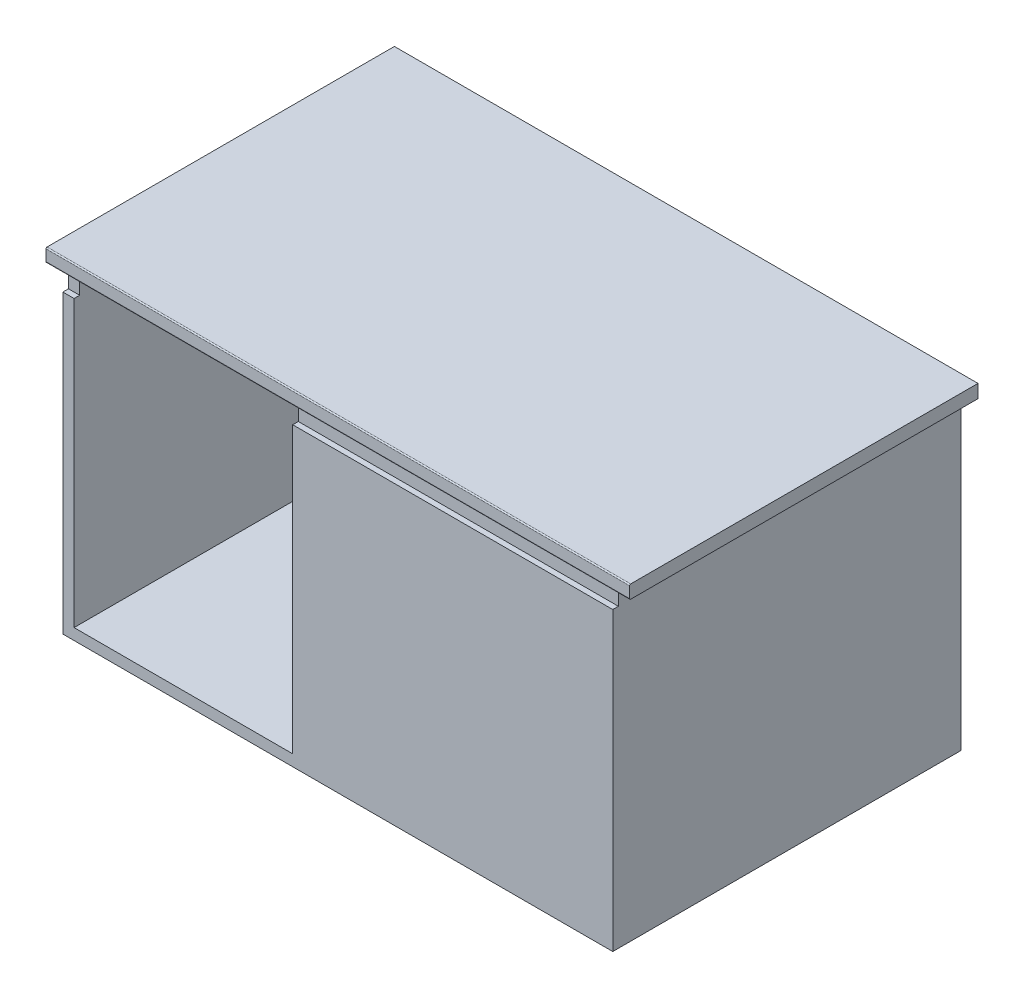
ISO-10303-21;
HEADER;
FILE_DESCRIPTION(('STEP AP214'),'2;1');
FILE_NAME('part.step','',(''),(''),'','','');
FILE_SCHEMA(('AUTOMOTIVE_DESIGN { 1 0 10303 214 1 1 1 1 }'));
ENDSEC;
DATA;
#1=APPLICATION_CONTEXT('core data for automotive mechanical design processes');
#2=APPLICATION_PROTOCOL_DEFINITION('international standard','automotive_design',2000,#1);
#3=PRODUCT_CONTEXT('',#1,'mechanical');
#4=PRODUCT('Part','Part','',(#3));
#5=PRODUCT_RELATED_PRODUCT_CATEGORY('part','',(#4));
#6=PRODUCT_DEFINITION_FORMATION('','',#4);
#7=PRODUCT_DEFINITION_CONTEXT('part definition',#1,'design');
#8=PRODUCT_DEFINITION('design','',#6,#7);
#9=PRODUCT_DEFINITION_SHAPE('','',#8);
#10=(LENGTH_UNIT() NAMED_UNIT(*) SI_UNIT(.MILLI.,.METRE.));
#11=(NAMED_UNIT(*) PLANE_ANGLE_UNIT() SI_UNIT($,.RADIAN.));
#12=(NAMED_UNIT(*) SI_UNIT($,.STERADIAN.) SOLID_ANGLE_UNIT());
#13=UNCERTAINTY_MEASURE_WITH_UNIT(LENGTH_MEASURE(1.E-05),#10,'distance_accuracy_value','');
#14=(GEOMETRIC_REPRESENTATION_CONTEXT(3) GLOBAL_UNCERTAINTY_ASSIGNED_CONTEXT((#13)) GLOBAL_UNIT_ASSIGNED_CONTEXT((#10,
#11,#12)) REPRESENTATION_CONTEXT('',''));
#15=CARTESIAN_POINT('',(0.,0.,0.));
#16=DIRECTION('',(0.,0.,1.));
#17=DIRECTION('',(1.,0.,0.));
#18=AXIS2_PLACEMENT_3D('',#15,#16,#17);
#19=CARTESIAN_POINT('',(-660.,670.,381.3));
#20=DIRECTION('',(0.,-1.,0.));
#21=DIRECTION('',(0.,0.,-1.));
#22=AXIS2_PLACEMENT_3D('',#19,#20,#21);
#23=PLANE('',#22);
#24=DIRECTION('',(1.,0.,0.));
#25=VECTOR('',#24,1.);
#26=CARTESIAN_POINT('',(-660.,670.,394.));
#27=LINE('',#26,#25);
#28=CARTESIAN_POINT('',(-621.9,670.,394.));
#29=VERTEX_POINT('',#28);
#30=CARTESIAN_POINT('',(-596.5,670.,394.));
#31=VERTEX_POINT('',#30);
#32=EDGE_CURVE('E251',#29,#31,#27,.T.);
#33=ORIENTED_EDGE('',*,*,#32,.T.);
#34=DIRECTION('',(0.,0.,-1.));
#35=VECTOR('',#34,1.);
#36=CARTESIAN_POINT('',(-596.5,670.,381.3));
#37=LINE('',#36,#35);
#38=CARTESIAN_POINT('',(-596.5,670.,381.3));
#39=VERTEX_POINT('',#38);
#40=EDGE_CURVE('E167',#31,#39,#37,.T.);
#41=ORIENTED_EDGE('',*,*,#40,.T.);
#42=DIRECTION('',(1.,0.,0.));
#43=VECTOR('',#42,1.);
#44=CARTESIAN_POINT('',(-660.,670.,381.3));
#45=LINE('',#44,#43);
#46=CARTESIAN_POINT('',(-621.9,670.,381.3));
#47=VERTEX_POINT('',#46);
#48=EDGE_CURVE('E242',#47,#39,#45,.T.);
#49=ORIENTED_EDGE('',*,*,#48,.F.);
#50=DIRECTION('',(0.,0.,1.));
#51=VECTOR('',#50,1.);
#52=CARTESIAN_POINT('',(-621.9,670.,381.3));
#53=LINE('',#52,#51);
#54=EDGE_CURVE('E233',#47,#29,#53,.T.);
#55=ORIENTED_EDGE('',*,*,#54,.T.);
#56=EDGE_LOOP('',(#33,#41,#49,#55));
#57=FACE_BOUND('',#56,.T.);
#58=ADVANCED_FACE('F36',(#57),#23,.F.);
#59=CARTESIAN_POINT('',(0.,0.,381.3));
#60=DIRECTION('',(0.,0.,1.));
#61=DIRECTION('',(1.,0.,0.));
#62=AXIS2_PLACEMENT_3D('',#59,#60,#61);
#63=PLANE('',#62);
#64=DIRECTION('',(0.,-1.,0.));
#65=VECTOR('',#64,1.);
#66=CARTESIAN_POINT('',(-596.5,0.,381.3));
#67=LINE('',#66,#65);
#68=CARTESIAN_POINT('',(-596.5,708.,381.3));
#69=VERTEX_POINT('',#68);
#70=EDGE_CURVE('E203',#69,#39,#67,.T.);
#71=ORIENTED_EDGE('',*,*,#70,.F.);
#72=DIRECTION('',(-1.,0.,0.));
#73=VECTOR('',#72,1.);
#74=CARTESIAN_POINT('',(-660.,708.,381.3));
#75=LINE('',#74,#73);
#76=CARTESIAN_POINT('',(-621.9,708.,381.3));
#77=VERTEX_POINT('',#76);
#78=EDGE_CURVE('E245',#69,#77,#75,.T.);
#79=ORIENTED_EDGE('',*,*,#78,.T.);
#80=DIRECTION('',(0.,1.,0.));
#81=VECTOR('',#80,1.);
#82=CARTESIAN_POINT('',(-621.9,0.,381.3));
#83=LINE('',#82,#81);
#84=EDGE_CURVE('E214',#47,#77,#83,.T.);
#85=ORIENTED_EDGE('',*,*,#84,.F.);
#86=ORIENTED_EDGE('',*,*,#48,.T.);
#87=EDGE_LOOP('',(#71,#79,#85,#86));
#88=FACE_BOUND('',#87,.T.);
#89=ADVANCED_FACE('F331',(#88),#63,.T.);
#90=CARTESIAN_POINT('',(660.,738.,394.));
#91=DIRECTION('',(0.,0.,-1.));
#92=DIRECTION('',(-1.,0.,0.));
#93=AXIS2_PLACEMENT_3D('',#90,#91,#92);
#94=PLANE('',#93);
#95=DIRECTION('',(0.,-1.,0.));
#96=VECTOR('',#95,1.);
#97=CARTESIAN_POINT('',(-660.,738.,394.));
#98=LINE('',#97,#96);
#99=CARTESIAN_POINT('',(-660.,735.46,394.));
#100=VERTEX_POINT('',#99);
#101=CARTESIAN_POINT('',(-660.,710.54,394.));
#102=VERTEX_POINT('',#101);
#103=EDGE_CURVE('E280',#100,#102,#98,.T.);
#104=ORIENTED_EDGE('',*,*,#103,.T.);
#105=DIRECTION('',(-1.,0.,0.));
#106=VECTOR('',#105,1.);
#107=CARTESIAN_POINT('',(660.,710.54,394.));
#108=LINE('',#107,#106);
#109=CARTESIAN_POINT('',(660.,710.54,394.));
#110=VERTEX_POINT('',#109);
#111=EDGE_CURVE('E291',#102,#110,#108,.F.);
#112=ORIENTED_EDGE('',*,*,#111,.T.);
#113=DIRECTION('',(0.,-1.,0.));
#114=VECTOR('',#113,1.);
#115=CARTESIAN_POINT('',(660.,738.,394.));
#116=LINE('',#115,#114);
#117=CARTESIAN_POINT('',(660.,735.46,394.));
#118=VERTEX_POINT('',#117);
#119=EDGE_CURVE('E277',#118,#110,#116,.T.);
#120=ORIENTED_EDGE('',*,*,#119,.F.);
#121=DIRECTION('',(1.,0.,0.));
#122=VECTOR('',#121,1.);
#123=CARTESIAN_POINT('',(-660.,735.46,394.));
#124=LINE('',#123,#122);
#125=EDGE_CURVE('E289',#118,#100,#124,.F.);
#126=ORIENTED_EDGE('',*,*,#125,.T.);
#127=EDGE_LOOP('',(#104,#112,#120,#126));
#128=FACE_BOUND('',#127,.T.);
#129=ADVANCED_FACE('F364',(#128),#94,.F.);
#130=CARTESIAN_POINT('',(-660.,738.,394.));
#131=DIRECTION('',(1.,0.,0.));
#132=DIRECTION('',(0.,0.,-1.));
#133=AXIS2_PLACEMENT_3D('',#130,#131,#132);
#134=PLANE('',#133);
#135=DIRECTION('',(0.,-1.,0.));
#136=VECTOR('',#135,1.);
#137=CARTESIAN_POINT('',(-660.,738.,-394.));
#138=LINE('',#137,#136);
#139=CARTESIAN_POINT('',(-660.,738.,-394.));
#140=VERTEX_POINT('',#139);
#141=CARTESIAN_POINT('',(-660.,708.,-394.));
#142=VERTEX_POINT('',#141);
#143=EDGE_CURVE('E267',#140,#142,#138,.T.);
#144=ORIENTED_EDGE('',*,*,#143,.T.);
#145=DIRECTION('',(0.,0.,1.));
#146=VECTOR('',#145,1.);
#147=CARTESIAN_POINT('',(-660.,708.,381.3));
#148=LINE('',#147,#146);
#149=CARTESIAN_POINT('',(-660.,708.,391.46));
#150=VERTEX_POINT('',#149);
#151=EDGE_CURVE('E253',#142,#150,#148,.T.);
#152=ORIENTED_EDGE('',*,*,#151,.T.);
#153=CARTESIAN_POINT('',(-660.,710.54,391.46));
#154=DIRECTION('',(1.,0.,0.));
#155=DIRECTION('',(0.,0.,-1.));
#156=AXIS2_PLACEMENT_3D('',#153,#154,#155);
#157=CIRCLE('',#156,2.54);
#158=EDGE_CURVE('E287',#150,#102,#157,.F.);
#159=ORIENTED_EDGE('',*,*,#158,.T.);
#160=ORIENTED_EDGE('',*,*,#103,.F.);
#161=CARTESIAN_POINT('',(-660.,735.46,391.46));
#162=DIRECTION('',(1.,0.,0.));
#163=DIRECTION('',(0.,0.,-1.));
#164=AXIS2_PLACEMENT_3D('',#161,#162,#163);
#165=CIRCLE('',#164,2.54);
#166=CARTESIAN_POINT('',(-660.,738.,391.46));
#167=VERTEX_POINT('',#166);
#168=EDGE_CURVE('E285',#100,#167,#165,.F.);
#169=ORIENTED_EDGE('',*,*,#168,.T.);
#170=DIRECTION('',(0.,0.,1.));
#171=VECTOR('',#170,1.);
#172=CARTESIAN_POINT('',(-660.,738.,394.));
#173=LINE('',#172,#171);
#174=EDGE_CURVE('E259',#140,#167,#173,.T.);
#175=ORIENTED_EDGE('',*,*,#174,.F.);
#176=EDGE_LOOP('',(#144,#152,#159,#160,#169,#175));
#177=FACE_BOUND('',#176,.T.);
#178=ADVANCED_FACE('F309',(#177),#134,.F.);
#179=DIRECTION('',(1.,0.,0.));
#180=VECTOR('',#179,1.);
#181=CARTESIAN_POINT('',(-596.5,25.4,394.));
#182=LINE('',#181,#180);
#183=CARTESIAN_POINT('',(-596.5,25.4,394.));
#184=VERTEX_POINT('',#183);
#185=CARTESIAN_POINT('',(-102.,25.4,394.));
#186=VERTEX_POINT('',#185);
#187=EDGE_CURVE('E172',#184,#186,#182,.T.);
#188=ORIENTED_EDGE('',*,*,#187,.F.);
#189=DIRECTION('',(0.,-1.,0.));
#190=VECTOR('',#189,1.);
#191=CARTESIAN_POINT('',(-596.5,708.,394.));
#192=LINE('',#191,#190);
#193=EDGE_CURVE('E162',#31,#184,#192,.T.);
#194=ORIENTED_EDGE('',*,*,#193,.F.);
#195=ORIENTED_EDGE('',*,*,#32,.F.);
#196=DIRECTION('',(0.,-1.,0.));
#197=VECTOR('',#196,1.);
#198=CARTESIAN_POINT('',(-621.9,1496.92053465479,394.));
#199=LINE('',#198,#197);
#200=CARTESIAN_POINT('',(-621.9,0.,394.));
#201=VERTEX_POINT('',#200);
#202=EDGE_CURVE('E210',#29,#201,#199,.T.);
#203=ORIENTED_EDGE('',*,*,#202,.T.);
#204=DIRECTION('',(1.,0.,0.));
#205=VECTOR('',#204,1.);
#206=CARTESIAN_POINT('',(660.,0.,394.));
#207=LINE('',#206,#205);
#208=CARTESIAN_POINT('',(621.9,0.,394.));
#209=VERTEX_POINT('',#208);
#210=EDGE_CURVE('E256',#201,#209,#207,.T.);
#211=ORIENTED_EDGE('',*,*,#210,.T.);
#212=DIRECTION('',(0.,-1.,0.));
#213=VECTOR('',#212,1.);
#214=CARTESIAN_POINT('',(621.9,1496.92053465479,394.));
#215=LINE('',#214,#213);
#216=CARTESIAN_POINT('',(621.9,670.,394.));
#217=VERTEX_POINT('',#216);
#218=EDGE_CURVE('E209',#217,#209,#215,.T.);
#219=ORIENTED_EDGE('',*,*,#218,.F.);
#220=CARTESIAN_POINT('',(-102.,670.,394.));
#221=VERTEX_POINT('',#220);
#222=EDGE_CURVE('E241',#221,#217,#27,.T.);
#223=ORIENTED_EDGE('',*,*,#222,.F.);
#224=DIRECTION('',(0.,1.,0.));
#225=VECTOR('',#224,1.);
#226=CARTESIAN_POINT('',(-102.,708.,394.));
#227=LINE('',#226,#225);
#228=EDGE_CURVE('E183',#186,#221,#227,.T.);
#229=ORIENTED_EDGE('',*,*,#228,.F.);
#230=EDGE_LOOP('',(#188,#194,#195,#203,#211,#219,#223,#229));
#231=FACE_BOUND('',#230,.T.);
#232=ADVANCED_FACE('F185',(#231),#94,.F.);
#233=CARTESIAN_POINT('',(660.,738.,394.));
#234=DIRECTION('',(-1.,0.,0.));
#235=DIRECTION('',(0.,0.,1.));
#236=AXIS2_PLACEMENT_3D('',#233,#234,#235);
#237=PLANE('',#236);
#238=DIRECTION('',(0.,0.,1.));
#239=VECTOR('',#238,1.);
#240=CARTESIAN_POINT('',(660.,708.,381.3));
#241=LINE('',#240,#239);
#242=CARTESIAN_POINT('',(660.,708.,-394.));
#243=VERTEX_POINT('',#242);
#244=CARTESIAN_POINT('',(660.,708.,391.46));
#245=VERTEX_POINT('',#244);
#246=EDGE_CURVE('E250',#243,#245,#241,.T.);
#247=ORIENTED_EDGE('',*,*,#246,.F.);
#248=DIRECTION('',(0.,-1.,0.));
#249=VECTOR('',#248,1.);
#250=CARTESIAN_POINT('',(660.,738.,-394.));
#251=LINE('',#250,#249);
#252=CARTESIAN_POINT('',(660.,738.,-394.));
#253=VERTEX_POINT('',#252);
#254=EDGE_CURVE('E274',#253,#243,#251,.T.);
#255=ORIENTED_EDGE('',*,*,#254,.F.);
#256=DIRECTION('',(0.,0.,-1.));
#257=VECTOR('',#256,1.);
#258=CARTESIAN_POINT('',(660.,738.,394.));
#259=LINE('',#258,#257);
#260=CARTESIAN_POINT('',(660.,738.,391.46));
#261=VERTEX_POINT('',#260);
#262=EDGE_CURVE('E262',#261,#253,#259,.T.);
#263=ORIENTED_EDGE('',*,*,#262,.F.);
#264=CARTESIAN_POINT('',(660.,735.46,391.46));
#265=DIRECTION('',(-1.,0.,0.));
#266=DIRECTION('',(0.,0.,1.));
#267=AXIS2_PLACEMENT_3D('',#264,#265,#266);
#268=CIRCLE('',#267,2.54);
#269=EDGE_CURVE('E293',#261,#118,#268,.F.);
#270=ORIENTED_EDGE('',*,*,#269,.T.);
#271=ORIENTED_EDGE('',*,*,#119,.T.);
#272=CARTESIAN_POINT('',(660.,710.54,391.46));
#273=DIRECTION('',(-1.,0.,0.));
#274=DIRECTION('',(0.,0.,1.));
#275=AXIS2_PLACEMENT_3D('',#272,#273,#274);
#276=CIRCLE('',#275,2.54);
#277=EDGE_CURVE('E44',#110,#245,#276,.F.);
#278=ORIENTED_EDGE('',*,*,#277,.T.);
#279=EDGE_LOOP('',(#247,#255,#263,#270,#271,#278));
#280=FACE_BOUND('',#279,.T.);
#281=ADVANCED_FACE('F296',(#280),#237,.F.);
#282=CARTESIAN_POINT('',(660.,738.,-394.));
#283=DIRECTION('',(0.,0.,1.));
#284=DIRECTION('',(1.,0.,0.));
#285=AXIS2_PLACEMENT_3D('',#282,#283,#284);
#286=PLANE('',#285);
#287=ORIENTED_EDGE('',*,*,#254,.T.);
#288=DIRECTION('',(1.,0.,0.));
#289=VECTOR('',#288,1.);
#290=CARTESIAN_POINT('',(660.,708.,-394.));
#291=LINE('',#290,#289);
#292=CARTESIAN_POINT('',(621.9,708.,-394.));
#293=VERTEX_POINT('',#292);
#294=EDGE_CURVE('E211',#293,#243,#291,.T.);
#295=ORIENTED_EDGE('',*,*,#294,.F.);
#296=DIRECTION('',(0.,-1.,0.));
#297=VECTOR('',#296,1.);
#298=CARTESIAN_POINT('',(621.9,1496.92053465479,-394.));
#299=LINE('',#298,#297);
#300=CARTESIAN_POINT('',(621.9,0.,-394.));
#301=VERTEX_POINT('',#300);
#302=EDGE_CURVE('E215',#293,#301,#299,.T.);
#303=ORIENTED_EDGE('',*,*,#302,.T.);
#304=DIRECTION('',(-1.,0.,0.));
#305=VECTOR('',#304,1.);
#306=CARTESIAN_POINT('',(660.,0.,-394.));
#307=LINE('',#306,#305);
#308=CARTESIAN_POINT('',(-621.9,0.,-394.));
#309=VERTEX_POINT('',#308);
#310=EDGE_CURVE('E263',#301,#309,#307,.T.);
#311=ORIENTED_EDGE('',*,*,#310,.T.);
#312=DIRECTION('',(0.,-1.,0.));
#313=VECTOR('',#312,1.);
#314=CARTESIAN_POINT('',(-621.9,1496.92053465479,-394.));
#315=LINE('',#314,#313);
#316=CARTESIAN_POINT('',(-621.9,708.,-394.));
#317=VERTEX_POINT('',#316);
#318=EDGE_CURVE('E224',#317,#309,#315,.T.);
#319=ORIENTED_EDGE('',*,*,#318,.F.);
#320=DIRECTION('',(1.,0.,0.));
#321=VECTOR('',#320,1.);
#322=CARTESIAN_POINT('',(-660.,708.,-394.));
#323=LINE('',#322,#321);
#324=EDGE_CURVE('E221',#142,#317,#323,.T.);
#325=ORIENTED_EDGE('',*,*,#324,.F.);
#326=ORIENTED_EDGE('',*,*,#143,.F.);
#327=DIRECTION('',(-1.,0.,0.));
#328=VECTOR('',#327,1.);
#329=CARTESIAN_POINT('',(660.,738.,-394.));
#330=LINE('',#329,#328);
#331=EDGE_CURVE('E265',#253,#140,#330,.T.);
#332=ORIENTED_EDGE('',*,*,#331,.F.);
#333=EDGE_LOOP('',(#287,#295,#303,#311,#319,#325,#326,#332));
#334=FACE_BOUND('',#333,.T.);
#335=ADVANCED_FACE('F315',(#334),#286,.F.);
#336=CARTESIAN_POINT('',(0.,738.,0.));
#337=DIRECTION('',(0.,1.,0.));
#338=DIRECTION('',(0.,0.,1.));
#339=AXIS2_PLACEMENT_3D('',#336,#337,#338);
#340=PLANE('',#339);
#341=ORIENTED_EDGE('',*,*,#174,.T.);
#342=DIRECTION('',(1.,0.,0.));
#343=VECTOR('',#342,1.);
#344=CARTESIAN_POINT('',(660.,738.,391.46));
#345=LINE('',#344,#343);
#346=EDGE_CURVE('E12',#167,#261,#345,.T.);
#347=ORIENTED_EDGE('',*,*,#346,.T.);
#348=ORIENTED_EDGE('',*,*,#262,.T.);
#349=ORIENTED_EDGE('',*,*,#331,.T.);
#350=EDGE_LOOP('',(#341,#347,#348,#349));
#351=FACE_BOUND('',#350,.T.);
#352=ADVANCED_FACE('F479',(#351),#340,.T.);
#353=CARTESIAN_POINT('',(0.,0.,0.));
#354=DIRECTION('',(0.,1.,0.));
#355=DIRECTION('',(0.,0.,1.));
#356=AXIS2_PLACEMENT_3D('',#353,#354,#355);
#357=PLANE('',#356);
#358=ORIENTED_EDGE('',*,*,#310,.F.);
#359=DIRECTION('',(0.,0.,-1.));
#360=VECTOR('',#359,1.);
#361=CARTESIAN_POINT('',(621.9,0.,-394.));
#362=LINE('',#361,#360);
#363=EDGE_CURVE('E207',#209,#301,#362,.T.);
#364=ORIENTED_EDGE('',*,*,#363,.F.);
#365=ORIENTED_EDGE('',*,*,#210,.F.);
#366=DIRECTION('',(0.,0.,1.));
#367=VECTOR('',#366,1.);
#368=CARTESIAN_POINT('',(-621.9,0.,394.));
#369=LINE('',#368,#367);
#370=EDGE_CURVE('E206',#309,#201,#369,.T.);
#371=ORIENTED_EDGE('',*,*,#370,.F.);
#372=EDGE_LOOP('',(#358,#364,#365,#371));
#373=FACE_BOUND('',#372,.T.);
#374=ADVANCED_FACE('F323',(#373),#357,.F.);
#375=CARTESIAN_POINT('',(-660.,708.,381.3));
#376=DIRECTION('',(0.,1.,0.));
#377=DIRECTION('',(-1.,0.,0.));
#378=AXIS2_PLACEMENT_3D('',#375,#376,#377);
#379=PLANE('',#378);
#380=DIRECTION('',(-1.,0.,0.));
#381=VECTOR('',#380,1.);
#382=CARTESIAN_POINT('',(-660.,708.,391.46));
#383=LINE('',#382,#381);
#384=EDGE_CURVE('E283',#245,#150,#383,.T.);
#385=ORIENTED_EDGE('',*,*,#384,.T.);
#386=ORIENTED_EDGE('',*,*,#151,.F.);
#387=ORIENTED_EDGE('',*,*,#324,.T.);
#388=DIRECTION('',(0.,0.,1.));
#389=VECTOR('',#388,1.);
#390=CARTESIAN_POINT('',(-621.9,708.,394.));
#391=LINE('',#390,#389);
#392=EDGE_CURVE('E225',#317,#77,#391,.T.);
#393=ORIENTED_EDGE('',*,*,#392,.T.);
#394=ORIENTED_EDGE('',*,*,#78,.F.);
#395=DIRECTION('',(0.,0.,1.));
#396=VECTOR('',#395,1.);
#397=CARTESIAN_POINT('',(-596.5,708.,-1236.89561038126));
#398=LINE('',#397,#396);
#399=CARTESIAN_POINT('',(-596.5,708.,-368.6));
#400=VERTEX_POINT('',#399);
#401=EDGE_CURVE('E191',#400,#69,#398,.T.);
#402=ORIENTED_EDGE('',*,*,#401,.F.);
#403=DIRECTION('',(1.,0.,0.));
#404=VECTOR('',#403,1.);
#405=CARTESIAN_POINT('',(-596.5,708.,-368.6));
#406=LINE('',#405,#404);
#407=CARTESIAN_POINT('',(-102.,708.,-368.6));
#408=VERTEX_POINT('',#407);
#409=EDGE_CURVE('E335',#400,#408,#406,.T.);
#410=ORIENTED_EDGE('',*,*,#409,.T.);
#411=DIRECTION('',(0.,0.,1.));
#412=VECTOR('',#411,1.);
#413=CARTESIAN_POINT('',(-102.,708.,-1236.89561038126));
#414=LINE('',#413,#412);
#415=CARTESIAN_POINT('',(-102.,708.,381.3));
#416=VERTEX_POINT('',#415);
#417=EDGE_CURVE('E194',#408,#416,#414,.T.);
#418=ORIENTED_EDGE('',*,*,#417,.T.);
#419=CARTESIAN_POINT('',(621.9,708.,381.3));
#420=VERTEX_POINT('',#419);
#421=EDGE_CURVE('E247',#420,#416,#75,.T.);
#422=ORIENTED_EDGE('',*,*,#421,.F.);
#423=DIRECTION('',(0.,0.,-1.));
#424=VECTOR('',#423,1.);
#425=CARTESIAN_POINT('',(621.9,708.,-394.));
#426=LINE('',#425,#424);
#427=EDGE_CURVE('E59',#420,#293,#426,.T.);
#428=ORIENTED_EDGE('',*,*,#427,.T.);
#429=ORIENTED_EDGE('',*,*,#294,.T.);
#430=ORIENTED_EDGE('',*,*,#246,.T.);
#431=EDGE_LOOP('',(#385,#386,#387,#393,#394,#402,#410,#418,#422,#428,#429,#430));
#432=FACE_BOUND('',#431,.T.);
#433=ADVANCED_FACE('F303',(#432),#379,.F.);
#434=CARTESIAN_POINT('',(-102.,670.,381.3));
#435=VERTEX_POINT('',#434);
#436=CARTESIAN_POINT('',(621.9,670.,381.3));
#437=VERTEX_POINT('',#436);
#438=EDGE_CURVE('E246',#435,#437,#45,.T.);
#439=ORIENTED_EDGE('',*,*,#438,.F.);
#440=DIRECTION('',(0.,0.,1.));
#441=VECTOR('',#440,1.);
#442=CARTESIAN_POINT('',(-102.,670.,381.3));
#443=LINE('',#442,#441);
#444=EDGE_CURVE('E51',#435,#221,#443,.T.);
#445=ORIENTED_EDGE('',*,*,#444,.T.);
#446=ORIENTED_EDGE('',*,*,#222,.T.);
#447=DIRECTION('',(0.,0.,-1.));
#448=VECTOR('',#447,1.);
#449=CARTESIAN_POINT('',(621.9,670.,381.3));
#450=LINE('',#449,#448);
#451=EDGE_CURVE('E238',#217,#437,#450,.T.);
#452=ORIENTED_EDGE('',*,*,#451,.T.);
#453=EDGE_LOOP('',(#439,#445,#446,#452));
#454=FACE_BOUND('',#453,.T.);
#455=ADVANCED_FACE('F350',(#454),#23,.F.);
#456=DIRECTION('',(0.,1.,0.));
#457=VECTOR('',#456,1.);
#458=CARTESIAN_POINT('',(-102.,0.,381.3));
#459=LINE('',#458,#457);
#460=EDGE_CURVE('E199',#435,#416,#459,.T.);
#461=ORIENTED_EDGE('',*,*,#460,.F.);
#462=ORIENTED_EDGE('',*,*,#438,.T.);
#463=DIRECTION('',(0.,-1.,0.));
#464=VECTOR('',#463,1.);
#465=CARTESIAN_POINT('',(621.9,0.,381.3));
#466=LINE('',#465,#464);
#467=EDGE_CURVE('E236',#420,#437,#466,.T.);
#468=ORIENTED_EDGE('',*,*,#467,.F.);
#469=ORIENTED_EDGE('',*,*,#421,.T.);
#470=EDGE_LOOP('',(#461,#462,#468,#469));
#471=FACE_BOUND('',#470,.T.);
#472=ADVANCED_FACE('F345',(#471),#63,.T.);
#473=CARTESIAN_POINT('',(-660.,710.54,391.46));
#474=DIRECTION('',(-1.,0.,0.));
#475=DIRECTION('',(0.,-1.,0.));
#476=AXIS2_PLACEMENT_3D('',#473,#474,#475);
#477=CYLINDRICAL_SURFACE('',#476,2.54);
#478=ORIENTED_EDGE('',*,*,#277,.F.);
#479=ORIENTED_EDGE('',*,*,#111,.F.);
#480=ORIENTED_EDGE('',*,*,#158,.F.);
#481=ORIENTED_EDGE('',*,*,#384,.F.);
#482=EDGE_LOOP('',(#478,#479,#480,#481));
#483=FACE_BOUND('',#482,.T.);
#484=ADVANCED_FACE('F306',(#483),#477,.T.);
#485=CARTESIAN_POINT('',(0.,735.46,391.46));
#486=DIRECTION('',(-1.,0.,0.));
#487=DIRECTION('',(0.,0.,1.));
#488=AXIS2_PLACEMENT_3D('',#485,#486,#487);
#489=CYLINDRICAL_SURFACE('',#488,2.54);
#490=ORIENTED_EDGE('',*,*,#168,.F.);
#491=ORIENTED_EDGE('',*,*,#125,.F.);
#492=ORIENTED_EDGE('',*,*,#269,.F.);
#493=ORIENTED_EDGE('',*,*,#346,.F.);
#494=EDGE_LOOP('',(#490,#491,#492,#493));
#495=FACE_BOUND('',#494,.T.);
#496=ADVANCED_FACE('F38',(#495),#489,.T.);
#497=CARTESIAN_POINT('',(-621.9,1496.92053465479,394.));
#498=DIRECTION('',(1.,0.,0.));
#499=DIRECTION('',(0.,0.,-1.));
#500=AXIS2_PLACEMENT_3D('',#497,#498,#499);
#501=PLANE('',#500);
#502=ORIENTED_EDGE('',*,*,#84,.T.);
#503=ORIENTED_EDGE('',*,*,#392,.F.);
#504=ORIENTED_EDGE('',*,*,#318,.T.);
#505=ORIENTED_EDGE('',*,*,#370,.T.);
#506=ORIENTED_EDGE('',*,*,#202,.F.);
#507=ORIENTED_EDGE('',*,*,#54,.F.);
#508=EDGE_LOOP('',(#502,#503,#504,#505,#506,#507));
#509=FACE_BOUND('',#508,.T.);
#510=ADVANCED_FACE('F320',(#509),#501,.F.);
#511=CARTESIAN_POINT('',(621.9,1496.92053465479,-394.));
#512=DIRECTION('',(-1.,0.,0.));
#513=DIRECTION('',(0.,0.,1.));
#514=AXIS2_PLACEMENT_3D('',#511,#512,#513);
#515=PLANE('',#514);
#516=ORIENTED_EDGE('',*,*,#218,.T.);
#517=ORIENTED_EDGE('',*,*,#363,.T.);
#518=ORIENTED_EDGE('',*,*,#302,.F.);
#519=ORIENTED_EDGE('',*,*,#427,.F.);
#520=ORIENTED_EDGE('',*,*,#467,.T.);
#521=ORIENTED_EDGE('',*,*,#451,.F.);
#522=EDGE_LOOP('',(#516,#517,#518,#519,#520,#521));
#523=FACE_BOUND('',#522,.T.);
#524=ADVANCED_FACE('F348',(#523),#515,.F.);
#525=CARTESIAN_POINT('',(-596.5,708.,-1236.89561038126));
#526=DIRECTION('',(-1.,0.,0.));
#527=DIRECTION('',(0.,-1.,0.));
#528=AXIS2_PLACEMENT_3D('',#525,#526,#527);
#529=PLANE('',#528);
#530=ORIENTED_EDGE('',*,*,#193,.T.);
#531=DIRECTION('',(0.,0.,1.));
#532=VECTOR('',#531,1.);
#533=CARTESIAN_POINT('',(-596.5,25.4,-1236.89561038126));
#534=LINE('',#533,#532);
#535=CARTESIAN_POINT('',(-596.5,25.4,-368.6));
#536=VERTEX_POINT('',#535);
#537=EDGE_CURVE('E165',#536,#184,#534,.T.);
#538=ORIENTED_EDGE('',*,*,#537,.F.);
#539=DIRECTION('',(0.,1.,0.));
#540=VECTOR('',#539,1.);
#541=CARTESIAN_POINT('',(-596.5,708.,-368.6));
#542=LINE('',#541,#540);
#543=EDGE_CURVE('E200',#536,#400,#542,.T.);
#544=ORIENTED_EDGE('',*,*,#543,.T.);
#545=ORIENTED_EDGE('',*,*,#401,.T.);
#546=ORIENTED_EDGE('',*,*,#70,.T.);
#547=ORIENTED_EDGE('',*,*,#40,.F.);
#548=EDGE_LOOP('',(#530,#538,#544,#545,#546,#547));
#549=FACE_BOUND('',#548,.T.);
#550=ADVANCED_FACE('F164',(#549),#529,.F.);
#551=CARTESIAN_POINT('',(-102.,708.,-1236.89561038126));
#552=DIRECTION('',(1.,0.,0.));
#553=DIRECTION('',(0.,1.,0.));
#554=AXIS2_PLACEMENT_3D('',#551,#552,#553);
#555=PLANE('',#554);
#556=ORIENTED_EDGE('',*,*,#460,.T.);
#557=ORIENTED_EDGE('',*,*,#417,.F.);
#558=DIRECTION('',(0.,-1.,0.));
#559=VECTOR('',#558,1.);
#560=CARTESIAN_POINT('',(-102.,708.,-368.6));
#561=LINE('',#560,#559);
#562=CARTESIAN_POINT('',(-102.,25.4,-368.6));
#563=VERTEX_POINT('',#562);
#564=EDGE_CURVE('E193',#408,#563,#561,.T.);
#565=ORIENTED_EDGE('',*,*,#564,.T.);
#566=DIRECTION('',(0.,0.,1.));
#567=VECTOR('',#566,1.);
#568=CARTESIAN_POINT('',(-102.,25.4,-1236.89561038126));
#569=LINE('',#568,#567);
#570=EDGE_CURVE('E182',#563,#186,#569,.T.);
#571=ORIENTED_EDGE('',*,*,#570,.T.);
#572=ORIENTED_EDGE('',*,*,#228,.T.);
#573=ORIENTED_EDGE('',*,*,#444,.F.);
#574=EDGE_LOOP('',(#556,#557,#565,#571,#572,#573));
#575=FACE_BOUND('',#574,.T.);
#576=ADVANCED_FACE('F342',(#575),#555,.F.);
#577=CARTESIAN_POINT('',(-596.5,25.4,-1236.89561038126));
#578=DIRECTION('',(0.,-1.,0.));
#579=DIRECTION('',(1.,0.,0.));
#580=AXIS2_PLACEMENT_3D('',#577,#578,#579);
#581=PLANE('',#580);
#582=DIRECTION('',(-1.,0.,0.));
#583=VECTOR('',#582,1.);
#584=CARTESIAN_POINT('',(-596.5,25.4,-368.6));
#585=LINE('',#584,#583);
#586=EDGE_CURVE('E180',#563,#536,#585,.T.);
#587=ORIENTED_EDGE('',*,*,#586,.T.);
#588=ORIENTED_EDGE('',*,*,#537,.T.);
#589=ORIENTED_EDGE('',*,*,#187,.T.);
#590=ORIENTED_EDGE('',*,*,#570,.F.);
#591=EDGE_LOOP('',(#587,#588,#589,#590));
#592=FACE_BOUND('',#591,.T.);
#593=ADVANCED_FACE('F176',(#592),#581,.F.);
#594=CARTESIAN_POINT('',(660.,738.,-368.6));
#595=DIRECTION('',(0.,0.,1.));
#596=DIRECTION('',(1.,0.,0.));
#597=AXIS2_PLACEMENT_3D('',#594,#595,#596);
#598=PLANE('',#597);
#599=ORIENTED_EDGE('',*,*,#543,.F.);
#600=ORIENTED_EDGE('',*,*,#586,.F.);
#601=ORIENTED_EDGE('',*,*,#564,.F.);
#602=ORIENTED_EDGE('',*,*,#409,.F.);
#603=EDGE_LOOP('',(#599,#600,#601,#602));
#604=FACE_BOUND('',#603,.T.);
#605=ADVANCED_FACE('F338',(#604),#598,.T.);
#606=CLOSED_SHELL('',(#58,#89,#129,#178,#232,#281,#335,#352,#374,#433,#455,#472,#484,#496,#510,
#524,#550,#576,#593,#605));
#607=MANIFOLD_SOLID_BREP('B2',#606);
#608=ADVANCED_BREP_SHAPE_REPRESENTATION('',(#18,#607),#14);
#609=SHAPE_DEFINITION_REPRESENTATION(#9,#608);
ENDSEC;
END-ISO-10303-21;
